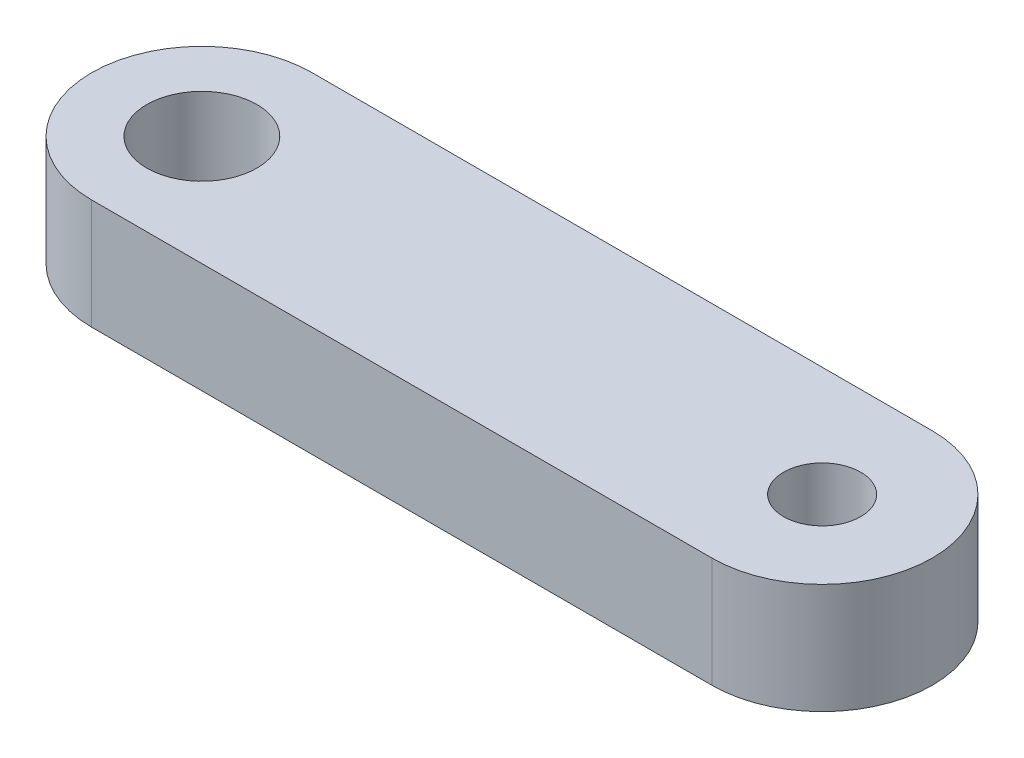
ISO-10303-21;
HEADER;
FILE_DESCRIPTION(('STEP AP214'),'2;1');
FILE_NAME('part.step','',(''),(''),'','','');
FILE_SCHEMA(('AUTOMOTIVE_DESIGN { 1 0 10303 214 1 1 1 1 }'));
ENDSEC;
DATA;
#1=APPLICATION_CONTEXT('core data for automotive mechanical design processes');
#2=APPLICATION_PROTOCOL_DEFINITION('international standard','automotive_design',2000,#1);
#3=PRODUCT_CONTEXT('',#1,'mechanical');
#4=PRODUCT('Part','Part','',(#3));
#5=PRODUCT_RELATED_PRODUCT_CATEGORY('part','',(#4));
#6=PRODUCT_DEFINITION_FORMATION('','',#4);
#7=PRODUCT_DEFINITION_CONTEXT('part definition',#1,'design');
#8=PRODUCT_DEFINITION('design','',#6,#7);
#9=PRODUCT_DEFINITION_SHAPE('','',#8);
#10=(LENGTH_UNIT() NAMED_UNIT(*) SI_UNIT(.MILLI.,.METRE.));
#11=(NAMED_UNIT(*) PLANE_ANGLE_UNIT() SI_UNIT($,.RADIAN.));
#12=(NAMED_UNIT(*) SI_UNIT($,.STERADIAN.) SOLID_ANGLE_UNIT());
#13=UNCERTAINTY_MEASURE_WITH_UNIT(LENGTH_MEASURE(1.E-05),#10,'distance_accuracy_value','');
#14=(GEOMETRIC_REPRESENTATION_CONTEXT(3) GLOBAL_UNCERTAINTY_ASSIGNED_CONTEXT((#13)) GLOBAL_UNIT_ASSIGNED_CONTEXT((#10,
#11,#12)) REPRESENTATION_CONTEXT('',''));
#15=CARTESIAN_POINT('',(0.,0.,0.));
#16=DIRECTION('',(0.,0.,1.));
#17=DIRECTION('',(1.,0.,0.));
#18=AXIS2_PLACEMENT_3D('',#15,#16,#17);
#19=CARTESIAN_POINT('',(-14.07,5.,-10.));
#20=DIRECTION('',(0.,0.,-1.));
#21=DIRECTION('',(-1.,0.,0.));
#22=AXIS2_PLACEMENT_3D('',#19,#20,#21);
#23=PLANE('',#22);
#24=DIRECTION('',(1.,0.,0.));
#25=VECTOR('',#24,1.);
#26=CARTESIAN_POINT('',(-14.07,0.,-10.));
#27=LINE('',#26,#25);
#28=CARTESIAN_POINT('',(-14.07,0.,-10.));
#29=VERTEX_POINT('',#28);
#30=CARTESIAN_POINT('',(14.07,0.,-10.));
#31=VERTEX_POINT('',#30);
#32=EDGE_CURVE('E119',#29,#31,#27,.T.);
#33=ORIENTED_EDGE('',*,*,#32,.F.);
#34=DIRECTION('',(0.,-1.,0.));
#35=VECTOR('',#34,1.);
#36=CARTESIAN_POINT('',(-14.07,5.,-10.));
#37=LINE('',#36,#35);
#38=CARTESIAN_POINT('',(-14.07,5.,-10.));
#39=VERTEX_POINT('',#38);
#40=EDGE_CURVE('E11',#39,#29,#37,.T.);
#41=ORIENTED_EDGE('',*,*,#40,.F.);
#42=DIRECTION('',(1.,0.,0.));
#43=VECTOR('',#42,1.);
#44=CARTESIAN_POINT('',(-14.07,5.,-10.));
#45=LINE('',#44,#43);
#46=CARTESIAN_POINT('',(14.07,5.,-10.));
#47=VERTEX_POINT('',#46);
#48=EDGE_CURVE('E111',#39,#47,#45,.T.);
#49=ORIENTED_EDGE('',*,*,#48,.T.);
#50=DIRECTION('',(0.,-1.,0.));
#51=VECTOR('',#50,1.);
#52=CARTESIAN_POINT('',(14.07,5.,-10.));
#53=LINE('',#52,#51);
#54=EDGE_CURVE('E50',#47,#31,#53,.T.);
#55=ORIENTED_EDGE('',*,*,#54,.T.);
#56=EDGE_LOOP('',(#33,#41,#49,#55));
#57=FACE_BOUND('',#56,.T.);
#58=ADVANCED_FACE('F47',(#57),#23,.T.);
#59=CARTESIAN_POINT('',(-14.07,5.,-5.));
#60=DIRECTION('',(0.,-1.,0.));
#61=DIRECTION('',(0.,0.,-1.));
#62=AXIS2_PLACEMENT_3D('',#59,#60,#61);
#63=CYLINDRICAL_SURFACE('',#62,5.);
#64=CARTESIAN_POINT('',(-14.07,0.,-5.));
#65=DIRECTION('',(0.,1.,0.));
#66=DIRECTION('',(0.,0.,1.));
#67=AXIS2_PLACEMENT_3D('',#64,#65,#66);
#68=CIRCLE('',#67,5.);
#69=CARTESIAN_POINT('',(-14.07,0.,0.));
#70=VERTEX_POINT('',#69);
#71=EDGE_CURVE('E81',#29,#70,#68,.T.);
#72=ORIENTED_EDGE('',*,*,#71,.T.);
#73=DIRECTION('',(0.,-1.,0.));
#74=VECTOR('',#73,1.);
#75=CARTESIAN_POINT('',(-14.07,5.,0.));
#76=LINE('',#75,#74);
#77=CARTESIAN_POINT('',(-14.07,5.,0.));
#78=VERTEX_POINT('',#77);
#79=EDGE_CURVE('E57',#78,#70,#76,.T.);
#80=ORIENTED_EDGE('',*,*,#79,.F.);
#81=CARTESIAN_POINT('',(-14.07,5.,-5.));
#82=DIRECTION('',(0.,1.,0.));
#83=DIRECTION('',(0.,0.,1.));
#84=AXIS2_PLACEMENT_3D('',#81,#82,#83);
#85=CIRCLE('',#84,5.);
#86=EDGE_CURVE('E98',#39,#78,#85,.T.);
#87=ORIENTED_EDGE('',*,*,#86,.F.);
#88=ORIENTED_EDGE('',*,*,#40,.T.);
#89=EDGE_LOOP('',(#72,#80,#87,#88));
#90=FACE_BOUND('',#89,.T.);
#91=ADVANCED_FACE('F136',(#90),#63,.T.);
#92=CARTESIAN_POINT('',(-14.07,5.,0.));
#93=DIRECTION('',(0.,0.,-1.));
#94=DIRECTION('',(-1.,0.,0.));
#95=AXIS2_PLACEMENT_3D('',#92,#93,#94);
#96=PLANE('',#95);
#97=DIRECTION('',(1.,0.,0.));
#98=VECTOR('',#97,1.);
#99=CARTESIAN_POINT('',(-14.07,0.,0.));
#100=LINE('',#99,#98);
#101=CARTESIAN_POINT('',(14.07,0.,0.));
#102=VERTEX_POINT('',#101);
#103=EDGE_CURVE('E106',#70,#102,#100,.T.);
#104=ORIENTED_EDGE('',*,*,#103,.T.);
#105=DIRECTION('',(0.,-1.,0.));
#106=VECTOR('',#105,1.);
#107=CARTESIAN_POINT('',(14.07,5.,0.));
#108=LINE('',#107,#106);
#109=CARTESIAN_POINT('',(14.07,5.,0.));
#110=VERTEX_POINT('',#109);
#111=EDGE_CURVE('E103',#110,#102,#108,.T.);
#112=ORIENTED_EDGE('',*,*,#111,.F.);
#113=DIRECTION('',(1.,0.,0.));
#114=VECTOR('',#113,1.);
#115=CARTESIAN_POINT('',(-14.07,5.,0.));
#116=LINE('',#115,#114);
#117=EDGE_CURVE('E93',#78,#110,#116,.T.);
#118=ORIENTED_EDGE('',*,*,#117,.F.);
#119=ORIENTED_EDGE('',*,*,#79,.T.);
#120=EDGE_LOOP('',(#104,#112,#118,#119));
#121=FACE_BOUND('',#120,.T.);
#122=ADVANCED_FACE('F104',(#121),#96,.F.);
#123=CARTESIAN_POINT('',(14.07,5.,-5.00000000000001));
#124=DIRECTION('',(0.,-1.,0.));
#125=DIRECTION('',(0.,0.,-1.));
#126=AXIS2_PLACEMENT_3D('',#123,#124,#125);
#127=CYLINDRICAL_SURFACE('',#126,5.);
#128=CARTESIAN_POINT('',(14.07,0.,-5.00000000000001));
#129=DIRECTION('',(0.,-1.,0.));
#130=DIRECTION('',(0.,0.,-1.));
#131=AXIS2_PLACEMENT_3D('',#128,#129,#130);
#132=CIRCLE('',#131,5.);
#133=EDGE_CURVE('E123',#31,#102,#132,.T.);
#134=ORIENTED_EDGE('',*,*,#133,.F.);
#135=ORIENTED_EDGE('',*,*,#54,.F.);
#136=CARTESIAN_POINT('',(14.07,5.,-5.00000000000001));
#137=DIRECTION('',(0.,-1.,0.));
#138=DIRECTION('',(0.,0.,-1.));
#139=AXIS2_PLACEMENT_3D('',#136,#137,#138);
#140=CIRCLE('',#139,5.);
#141=EDGE_CURVE('E97',#47,#110,#140,.T.);
#142=ORIENTED_EDGE('',*,*,#141,.T.);
#143=ORIENTED_EDGE('',*,*,#111,.T.);
#144=EDGE_LOOP('',(#134,#135,#142,#143));
#145=FACE_BOUND('',#144,.T.);
#146=ADVANCED_FACE('F109',(#145),#127,.T.);
#147=CARTESIAN_POINT('',(14.07,5.,-5.00000000000001));
#148=DIRECTION('',(0.,-1.,0.));
#149=DIRECTION('',(0.,0.,-1.));
#150=AXIS2_PLACEMENT_3D('',#147,#148,#149);
#151=PLANE('',#150);
#152=CARTESIAN_POINT('',(-14.07,5.,-5.));
#153=DIRECTION('',(0.,1.,0.));
#154=DIRECTION('',(0.,0.,1.));
#155=AXIS2_PLACEMENT_3D('',#152,#153,#154);
#156=CIRCLE('',#155,2.5);
#157=CARTESIAN_POINT('',(-14.07,5.,-2.5));
#158=VERTEX_POINT('',#157);
#159=EDGE_CURVE('E172',#158,#158,#156,.T.);
#160=ORIENTED_EDGE('',*,*,#159,.F.);
#161=EDGE_LOOP('',(#160));
#162=FACE_BOUND('',#161,.T.);
#163=CARTESIAN_POINT('',(14.07,5.,-5.00000000000001));
#164=DIRECTION('',(0.,1.,0.));
#165=DIRECTION('',(0.,0.,1.));
#166=AXIS2_PLACEMENT_3D('',#163,#164,#165);
#167=CIRCLE('',#166,1.75);
#168=CARTESIAN_POINT('',(14.07,5.,-3.25000000000001));
#169=VERTEX_POINT('',#168);
#170=EDGE_CURVE('E174',#169,#169,#167,.T.);
#171=ORIENTED_EDGE('',*,*,#170,.F.);
#172=EDGE_LOOP('',(#171));
#173=FACE_BOUND('',#172,.T.);
#174=ORIENTED_EDGE('',*,*,#48,.F.);
#175=ORIENTED_EDGE('',*,*,#86,.T.);
#176=ORIENTED_EDGE('',*,*,#117,.T.);
#177=ORIENTED_EDGE('',*,*,#141,.F.);
#178=EDGE_LOOP('',(#174,#175,#176,#177));
#179=FACE_BOUND('',#178,.T.);
#180=ADVANCED_FACE('F96',(#162,#173,#179),#151,.F.);
#181=CARTESIAN_POINT('',(14.07,0.,-5.00000000000001));
#182=DIRECTION('',(0.,-1.,0.));
#183=DIRECTION('',(0.,0.,-1.));
#184=AXIS2_PLACEMENT_3D('',#181,#182,#183);
#185=PLANE('',#184);
#186=CARTESIAN_POINT('',(-14.07,0.,-5.));
#187=DIRECTION('',(0.,1.,0.));
#188=DIRECTION('',(0.,0.,1.));
#189=AXIS2_PLACEMENT_3D('',#186,#187,#188);
#190=CIRCLE('',#189,2.5);
#191=CARTESIAN_POINT('',(-14.07,0.,-2.5));
#192=VERTEX_POINT('',#191);
#193=EDGE_CURVE('E124',#192,#192,#190,.T.);
#194=ORIENTED_EDGE('',*,*,#193,.T.);
#195=EDGE_LOOP('',(#194));
#196=FACE_BOUND('',#195,.T.);
#197=CARTESIAN_POINT('',(14.07,0.,-5.00000000000001));
#198=DIRECTION('',(0.,1.,0.));
#199=DIRECTION('',(0.,0.,1.));
#200=AXIS2_PLACEMENT_3D('',#197,#198,#199);
#201=CIRCLE('',#200,1.75);
#202=CARTESIAN_POINT('',(14.07,0.,-3.25000000000001));
#203=VERTEX_POINT('',#202);
#204=EDGE_CURVE('E180',#203,#203,#201,.T.);
#205=ORIENTED_EDGE('',*,*,#204,.T.);
#206=EDGE_LOOP('',(#205));
#207=FACE_BOUND('',#206,.T.);
#208=ORIENTED_EDGE('',*,*,#32,.T.);
#209=ORIENTED_EDGE('',*,*,#133,.T.);
#210=ORIENTED_EDGE('',*,*,#103,.F.);
#211=ORIENTED_EDGE('',*,*,#71,.F.);
#212=EDGE_LOOP('',(#208,#209,#210,#211));
#213=FACE_BOUND('',#212,.T.);
#214=ADVANCED_FACE('F133',(#196,#207,#213),#185,.T.);
#215=CARTESIAN_POINT('',(14.07,0.,-5.00000000000001));
#216=DIRECTION('',(0.,1.,0.));
#217=DIRECTION('',(0.,0.,1.));
#218=AXIS2_PLACEMENT_3D('',#215,#216,#217);
#219=CYLINDRICAL_SURFACE('',#218,1.75);
#220=ORIENTED_EDGE('',*,*,#204,.F.);
#221=EDGE_LOOP('',(#220));
#222=FACE_BOUND('',#221,.T.);
#223=ORIENTED_EDGE('',*,*,#170,.T.);
#224=EDGE_LOOP('',(#223));
#225=FACE_BOUND('',#224,.T.);
#226=ADVANCED_FACE('F155',(#222,#225),#219,.F.);
#227=CARTESIAN_POINT('',(-14.07,0.,-5.));
#228=DIRECTION('',(0.,1.,0.));
#229=DIRECTION('',(0.,0.,1.));
#230=AXIS2_PLACEMENT_3D('',#227,#228,#229);
#231=CYLINDRICAL_SURFACE('',#230,2.5);
#232=ORIENTED_EDGE('',*,*,#193,.F.);
#233=EDGE_LOOP('',(#232));
#234=FACE_BOUND('',#233,.T.);
#235=ORIENTED_EDGE('',*,*,#159,.T.);
#236=EDGE_LOOP('',(#235));
#237=FACE_BOUND('',#236,.T.);
#238=ADVANCED_FACE('F162',(#234,#237),#231,.F.);
#239=CLOSED_SHELL('',(#58,#91,#122,#146,#180,#214,#226,#238));
#240=MANIFOLD_SOLID_BREP('B2',#239);
#241=ADVANCED_BREP_SHAPE_REPRESENTATION('',(#18,#240),#14);
#242=SHAPE_DEFINITION_REPRESENTATION(#9,#241);
ENDSEC;
END-ISO-10303-21;
